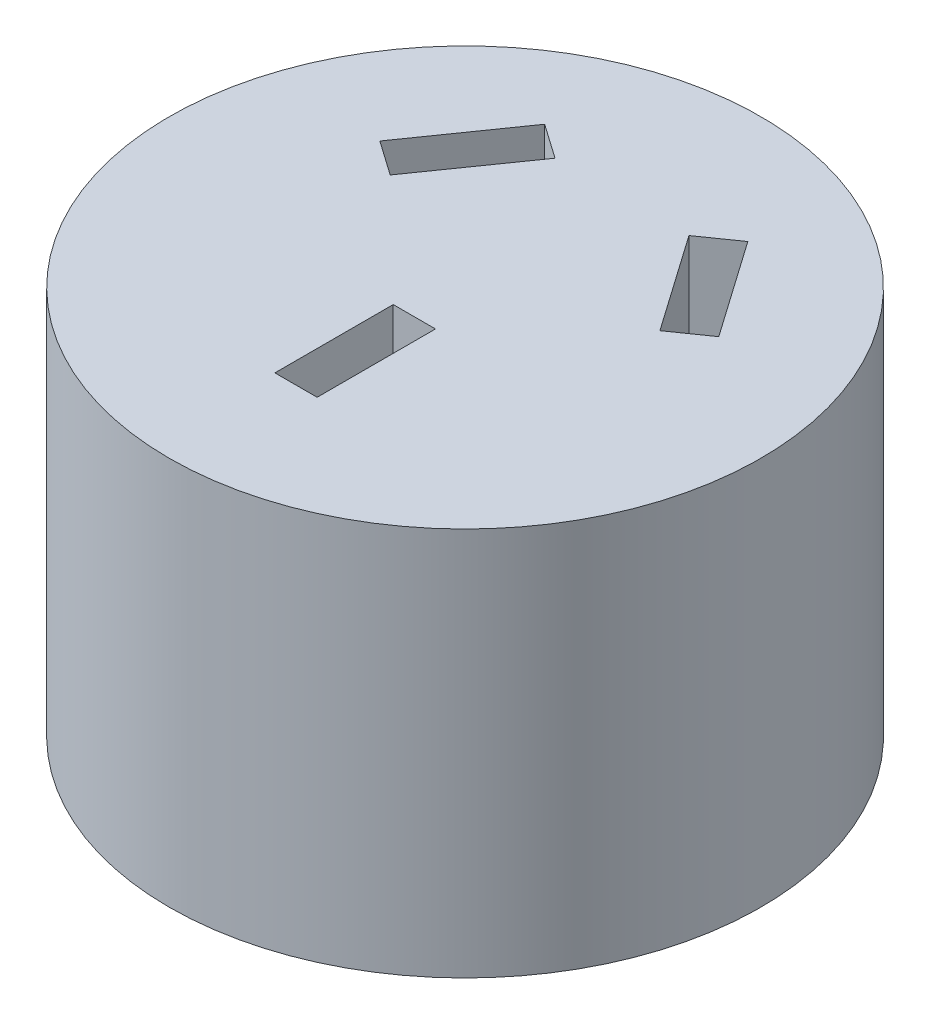
ISO-10303-21;
HEADER;
FILE_DESCRIPTION(('STEP AP214'),'2;1');
FILE_NAME('part.step','',(''),(''),'','','');
FILE_SCHEMA(('AUTOMOTIVE_DESIGN { 1 0 10303 214 1 1 1 1 }'));
ENDSEC;
DATA;
#1=APPLICATION_CONTEXT('core data for automotive mechanical design processes');
#2=APPLICATION_PROTOCOL_DEFINITION('international standard','automotive_design',2000,#1);
#3=PRODUCT_CONTEXT('',#1,'mechanical');
#4=PRODUCT('Part','Part','',(#3));
#5=PRODUCT_RELATED_PRODUCT_CATEGORY('part','',(#4));
#6=PRODUCT_DEFINITION_FORMATION('','',#4);
#7=PRODUCT_DEFINITION_CONTEXT('part definition',#1,'design');
#8=PRODUCT_DEFINITION('design','',#6,#7);
#9=PRODUCT_DEFINITION_SHAPE('','',#8);
#10=(LENGTH_UNIT() NAMED_UNIT(*) SI_UNIT(.MILLI.,.METRE.));
#11=(NAMED_UNIT(*) PLANE_ANGLE_UNIT() SI_UNIT($,.RADIAN.));
#12=(NAMED_UNIT(*) SI_UNIT($,.STERADIAN.) SOLID_ANGLE_UNIT());
#13=UNCERTAINTY_MEASURE_WITH_UNIT(LENGTH_MEASURE(1.E-05),#10,'distance_accuracy_value','');
#14=(GEOMETRIC_REPRESENTATION_CONTEXT(3) GLOBAL_UNCERTAINTY_ASSIGNED_CONTEXT((#13)) GLOBAL_UNIT_ASSIGNED_CONTEXT((#10,
#11,#12)) REPRESENTATION_CONTEXT('',''));
#15=CARTESIAN_POINT('',(0.,0.,0.));
#16=DIRECTION('',(0.,0.,1.));
#17=DIRECTION('',(1.,0.,0.));
#18=AXIS2_PLACEMENT_3D('',#15,#16,#17);
#19=CARTESIAN_POINT('',(0.,-11.5,0.));
#20=DIRECTION('',(0.,1.,0.));
#21=DIRECTION('',(0.,0.,1.));
#22=AXIS2_PLACEMENT_3D('',#19,#20,#21);
#23=CYLINDRICAL_SURFACE('',#22,17.5);
#24=CARTESIAN_POINT('',(-13.1596499769309,1.66512361776483,11.5357536591531));
#25=CARTESIAN_POINT('',(-13.1596555340036,1.9397524624613,11.5357507632046));
#26=CARTESIAN_POINT('',(-13.175312887176,2.21443132840201,11.517959771554));
#27=CARTESIAN_POINT('',(-13.2368491284706,2.75580171492137,11.4471811512366));
#28=CARTESIAN_POINT('',(-13.2827403091384,3.02248994051615,11.3941792063387));
#29=CARTESIAN_POINT('',(-13.4015471420366,3.53996661994382,11.2541938799733));
#30=CARTESIAN_POINT('',(-13.4744209409699,3.79077899730775,11.1672631149614));
#31=CARTESIAN_POINT('',(-13.6427187170808,4.27054314665069,10.9610160038921));
#32=CARTESIAN_POINT('',(-13.7381453715128,4.49949231870991,10.8416958126289));
#33=CARTESIAN_POINT('',(-13.9489856580926,4.93560253105194,10.5691143312473));
#34=CARTESIAN_POINT('',(-14.0648540806705,5.14204312308788,10.4150519022994));
#35=CARTESIAN_POINT('',(-14.3086992048061,5.52088057602431,10.0774216904281));
#36=CARTESIAN_POINT('',(-14.4366773215917,5.69327345057194,9.89385045713246));
#37=CARTESIAN_POINT('',(-14.7009857453358,6.00219523864863,9.49678147960872));
#38=CARTESIAN_POINT('',(-14.8374271085469,6.13799766714229,9.28279073388649));
#39=CARTESIAN_POINT('',(-15.1099871860003,6.36512805380476,8.83218586376441));
#40=CARTESIAN_POINT('',(-15.2461059579196,6.4564646708655,8.5955761547329));
#41=CARTESIAN_POINT('',(-15.5085846047979,6.58970977086412,8.1121784031836));
#42=CARTESIAN_POINT('',(-15.6351064652621,6.63284617202653,7.86581722802317));
#43=CARTESIAN_POINT('',(-15.8774937641688,6.67234045247293,7.36428542439035));
#44=CARTESIAN_POINT('',(-15.993361235352,6.66870727360822,7.10911648917274));
#45=CARTESIAN_POINT('',(-16.2078648939097,6.6156076804698,6.60514966089287));
#46=CARTESIAN_POINT('',(-16.3069024529847,6.56746958616994,6.35638089269609));
#47=CARTESIAN_POINT('',(-16.4899416249498,6.42888586160385,5.86519914186244));
#48=CARTESIAN_POINT('',(-16.5739423225383,6.33843765710932,5.62278654689518));
#49=CARTESIAN_POINT('',(-16.7272785339865,6.11685011573552,5.1488752620366));
#50=CARTESIAN_POINT('',(-16.7964436553654,5.98527667324486,4.9175248866455));
#51=CARTESIAN_POINT('',(-16.9196159240415,5.68551215176894,4.47541536025799));
#52=CARTESIAN_POINT('',(-16.9736197437573,5.51731304859548,4.26466073619512));
#53=CARTESIAN_POINT('',(-17.0695749057091,5.14210934122165,3.86312817033936));
#54=CARTESIAN_POINT('',(-17.1110367589145,4.93395003376466,3.67331087277448));
#55=CARTESIAN_POINT('',(-17.1813581012118,4.48833588813751,3.32894981796366));
#56=CARTESIAN_POINT('',(-17.2102165679262,4.25087867534587,3.17440892279879));
#57=CARTESIAN_POINT('',(-17.2576877018223,3.75079640655649,2.9053589842402));
#58=CARTESIAN_POINT('',(-17.2762167311151,3.48798555528976,2.7911793898275));
#59=CARTESIAN_POINT('',(-17.3045820773682,2.94624070916338,2.60959404642087));
#60=CARTESIAN_POINT('',(-17.3144209238164,2.66731143116368,2.54217468795753));
#61=CARTESIAN_POINT('',(-17.3264584703526,2.11142255690001,2.45877282563744));
#62=CARTESIAN_POINT('',(-17.3289058247193,1.83471907542317,2.44111763783853));
#63=CARTESIAN_POINT('',(-17.327187354544,1.28240282797153,2.45328789796236));
#64=CARTESIAN_POINT('',(-17.3230223549337,1.00678993023994,2.48310742312519));
#65=CARTESIAN_POINT('',(-17.3077179171922,0.47102054770508,2.5875762676201));
#66=CARTESIAN_POINT('',(-17.2967403588561,0.210654652726296,2.66118346959825));
#67=CARTESIAN_POINT('',(-17.2667561570037,-0.294381062228878,2.84923472440934));
#68=CARTESIAN_POINT('',(-17.247748354869,-0.539048611349121,2.96368466973801));
#69=CARTESIAN_POINT('',(-17.1994400146767,-1.01243157027722,3.23238029923699));
#70=CARTESIAN_POINT('',(-17.1698964422816,-1.24060249274071,3.38754057417764));
#71=CARTESIAN_POINT('',(-17.0986017471394,-1.66856731584353,3.73074797187346));
#72=CARTESIAN_POINT('',(-17.0568479775332,-1.8683550497655,3.91880222164676));
#73=CARTESIAN_POINT('',(-16.9575620070649,-2.24082492795565,4.32861898888295));
#74=CARTESIAN_POINT('',(-16.8995445643161,-2.41236381078201,4.55130540877333));
#75=CARTESIAN_POINT('',(-16.7668303379077,-2.714990585692,5.01818783615075));
#76=CARTESIAN_POINT('',(-16.6921344263847,-2.84608059204112,5.26238271853106));
#77=CARTESIAN_POINT('',(-16.5261205577387,-3.062837099801,5.76247742000632));
#78=CARTESIAN_POINT('',(-16.434935742535,-3.14884735620058,6.01827200293196));
#79=CARTESIAN_POINT('',(-16.2363909809542,-3.27394338708562,6.53499092710229));
#80=CARTESIAN_POINT('',(-16.1290352035626,-3.31304123268845,6.79591393117305));
#81=CARTESIAN_POINT('',(-15.904602445531,-3.34235496722967,7.3053680837599));
#82=CARTESIAN_POINT('',(-15.7879983109241,-3.3342367549423,7.55401294319619));
#83=CARTESIAN_POINT('',(-15.5455727303956,-3.27328067870938,8.041092885262));
#84=CARTESIAN_POINT('',(-15.4197517261324,-3.2204449562798,8.27952845623859));
#85=CARTESIAN_POINT('',(-15.1646798649361,-3.07254797978833,8.73789051610785));
#86=CARTESIAN_POINT('',(-15.0354697256479,-2.97786843487626,8.95796341629023));
#87=CARTESIAN_POINT('',(-14.7776947373397,-2.74931098652046,9.3771183871229));
#88=CARTESIAN_POINT('',(-14.6491299913583,-2.61542701450074,9.57619720153908));
#89=CARTESIAN_POINT('',(-14.3943860918973,-2.30763303867707,9.95516786172013));
#90=CARTESIAN_POINT('',(-14.2683915695826,-2.13265116527903,10.1343130939723));
#91=CARTESIAN_POINT('',(-14.0289298354482,-1.74960356858545,10.4632984507903));
#92=CARTESIAN_POINT('',(-13.9154660995505,-1.54152870446752,10.6131304529899));
#93=CARTESIAN_POINT('',(-13.7042845643893,-1.09163408979746,10.8845298076286));
#94=CARTESIAN_POINT('',(-13.6070586590022,-0.849071513678956,11.0052513377265));
#95=CARTESIAN_POINT('',(-13.4380907687255,-0.341071719153811,11.2109565362252));
#96=CARTESIAN_POINT('',(-13.3663345236454,-0.0756474045707011,11.2959602075894));
#97=CARTESIAN_POINT('',(-13.2606479078092,0.434257868386897,11.4197600061202));
#98=CARTESIAN_POINT('',(-13.2229636754451,0.676849488032007,11.4631884322895));
#99=CARTESIAN_POINT('',(-13.1724641572955,1.16798891363376,11.5211842921135));
#100=CARTESIAN_POINT('',(-13.1596449467938,1.41653577333953,11.5357562805004));
#101=CARTESIAN_POINT('',(-13.1596499769309,1.66512361776483,11.5357536591531));
#102=B_SPLINE_CURVE_WITH_KNOTS('',3,(#24,#25,#26,#27,#28,#29,#30,#31,#32,#33,#34,#35,#36,#37,
#38,#39,#40,#41,#42,#43,#44,#45,#46,#47,#48,#49,#50,#51,#52,#53,#54,#55,#56,#57,#58,#59,#60,#61,
#62,#63,#64,#65,#66,#67,#68,#69,#70,#71,#72,#73,#74,#75,#76,#77,#78,#79,#80,#81,#82,#83,#84,#85,
#86,#87,#88,#89,#90,#91,#92,#93,#94,#95,#96,#97,#98,#99,#100,#101),.UNSPECIFIED.,.T.,.F.,(4,2,2,
2,2,2,2,2,2,2,2,2,2,2,2,2,2,2,2,2,2,2,2,2,2,2,2,2,2,2,2,2,2,2,2,2,2,2,4),(0.,0.822970855909878,
1.64627652404716,2.4683104593411,3.29044202751837,4.13392918016541,4.97751503096208,
5.83678707534616,6.69589172544265,7.53257252571856,8.36909336381046,9.18142594108555,
9.99380794866306,10.8150725844623,11.6365173296209,12.486790317325,13.337132265744,
14.1942630157851,15.0511441949008,15.8788590834125,16.7064707175367,17.5151322414882,
18.3239104804765,19.152700151135,19.9816696155781,20.8386347094919,21.6955550021917,
22.5458421325277,23.3959104269914,24.216172442177,25.0363951773398,25.8492853098058,
26.6623013386561,27.4994942187098,28.3369187479583,29.1963403106312,30.0552799305204,
30.8003322217915,31.5452669038042),.UNSPECIFIED.);
#103=CARTESIAN_POINT('',(-13.1596499769309,1.66512361776483,11.5357536591531));
#104=VERTEX_POINT('',#103);
#105=EDGE_CURVE('E11',#104,#104,#102,.T.);
#106=ORIENTED_EDGE('',*,*,#105,.F.);
#107=EDGE_LOOP('',(#106));
#108=FACE_BOUND('',#107,.T.);
#109=CARTESIAN_POINT('',(0.,-11.5,0.));
#110=DIRECTION('',(0.,1.,0.));
#111=DIRECTION('',(0.,0.,1.));
#112=AXIS2_PLACEMENT_3D('',#109,#110,#111);
#113=CIRCLE('',#112,17.5);
#114=CARTESIAN_POINT('',(0.,-11.5,17.5));
#115=VERTEX_POINT('',#114);
#116=EDGE_CURVE('E46',#115,#115,#113,.T.);
#117=ORIENTED_EDGE('',*,*,#116,.T.);
#118=EDGE_LOOP('',(#117));
#119=FACE_BOUND('',#118,.T.);
#120=CARTESIAN_POINT('',(0.,11.5,0.));
#121=DIRECTION('',(0.,1.,0.));
#122=DIRECTION('',(0.,0.,1.));
#123=AXIS2_PLACEMENT_3D('',#120,#121,#122);
#124=CIRCLE('',#123,17.5);
#125=CARTESIAN_POINT('',(0.,11.5,17.5));
#126=VERTEX_POINT('',#125);
#127=EDGE_CURVE('E166',#126,#126,#124,.T.);
#128=ORIENTED_EDGE('',*,*,#127,.F.);
#129=EDGE_LOOP('',(#128));
#130=FACE_BOUND('',#129,.T.);
#131=ADVANCED_FACE('F34',(#108,#119,#130),#23,.T.);
#132=CARTESIAN_POINT('',(0.,-11.5,0.));
#133=DIRECTION('',(0.,1.,0.));
#134=DIRECTION('',(0.,0.,1.));
#135=AXIS2_PLACEMENT_3D('',#132,#133,#134);
#136=PLANE('',#135);
#137=CARTESIAN_POINT('',(10.,-11.5,3.));
#138=DIRECTION('',(0.,-1.,0.));
#139=DIRECTION('',(0.,0.,-1.));
#140=AXIS2_PLACEMENT_3D('',#137,#138,#139);
#141=CIRCLE('',#140,2.80000000000001);
#142=CARTESIAN_POINT('',(10.,-11.5,0.199999999999986));
#143=VERTEX_POINT('',#142);
#144=EDGE_CURVE('E336',#143,#143,#141,.T.);
#145=ORIENTED_EDGE('',*,*,#144,.F.);
#146=EDGE_LOOP('',(#145));
#147=FACE_BOUND('',#146,.T.);
#148=CARTESIAN_POINT('',(-10.,-11.5,3.));
#149=DIRECTION('',(0.,-1.,0.));
#150=DIRECTION('',(0.,0.,-1.));
#151=AXIS2_PLACEMENT_3D('',#148,#149,#150);
#152=CIRCLE('',#151,2.80000000000001);
#153=CARTESIAN_POINT('',(-10.,-11.5,0.199999999999986));
#154=VERTEX_POINT('',#153);
#155=EDGE_CURVE('E341',#154,#154,#152,.T.);
#156=ORIENTED_EDGE('',*,*,#155,.F.);
#157=EDGE_LOOP('',(#156));
#158=FACE_BOUND('',#157,.T.);
#159=DIRECTION('',(-1.,0.,0.));
#160=VECTOR('',#159,1.);
#161=CARTESIAN_POINT('',(1.25,-11.5,10.));
#162=LINE('',#161,#160);
#163=CARTESIAN_POINT('',(1.25,-11.5,10.));
#164=VERTEX_POINT('',#163);
#165=CARTESIAN_POINT('',(-1.25,-11.5,10.));
#166=VERTEX_POINT('',#165);
#167=EDGE_CURVE('E143',#164,#166,#162,.T.);
#168=ORIENTED_EDGE('',*,*,#167,.F.);
#169=DIRECTION('',(0.,0.,-1.));
#170=VECTOR('',#169,1.);
#171=CARTESIAN_POINT('',(1.25,-11.5,10.));
#172=LINE('',#171,#170);
#173=CARTESIAN_POINT('',(1.25,-11.5,3.));
#174=VERTEX_POINT('',#173);
#175=EDGE_CURVE('E135',#164,#174,#172,.T.);
#176=ORIENTED_EDGE('',*,*,#175,.T.);
#177=DIRECTION('',(1.,0.,0.));
#178=VECTOR('',#177,1.);
#179=CARTESIAN_POINT('',(-1.25,-11.5,3.));
#180=LINE('',#179,#178);
#181=CARTESIAN_POINT('',(-1.25,-11.5,3.));
#182=VERTEX_POINT('',#181);
#183=EDGE_CURVE('E126',#182,#174,#180,.T.);
#184=ORIENTED_EDGE('',*,*,#183,.F.);
#185=DIRECTION('',(0.,0.,-1.));
#186=VECTOR('',#185,1.);
#187=CARTESIAN_POINT('',(-1.25,-11.5,10.));
#188=LINE('',#187,#186);
#189=EDGE_CURVE('E134',#166,#182,#188,.T.);
#190=ORIENTED_EDGE('',*,*,#189,.F.);
#191=EDGE_LOOP('',(#168,#176,#184,#190));
#192=FACE_BOUND('',#191,.T.);
#193=DIRECTION('',(-0.819152044288993,0.,-0.573576436351044));
#194=VECTOR('',#193,1.);
#195=CARTESIAN_POINT('',(-7.97605994463876,-11.5,-3.54896514453825));
#196=LINE('',#195,#194);
#197=CARTESIAN_POINT('',(-7.97605994463876,-11.5,-3.54896514453825));
#198=VERTEX_POINT('',#197);
#199=CARTESIAN_POINT('',(-10.0239400553612,-11.5,-4.98290623541586));
#200=VERTEX_POINT('',#199);
#201=EDGE_CURVE('E178',#198,#200,#196,.T.);
#202=ORIENTED_EDGE('',*,*,#201,.F.);
#203=DIRECTION('',(0.573576436351044,0.,-0.819152044288993));
#204=VECTOR('',#203,1.);
#205=CARTESIAN_POINT('',(-7.97605994463876,-11.5,-3.54896514453825));
#206=LINE('',#205,#204);
#207=CARTESIAN_POINT('',(-3.96102489018145,-11.5,-9.2830294545612));
#208=VERTEX_POINT('',#207);
#209=EDGE_CURVE('E170',#198,#208,#206,.T.);
#210=ORIENTED_EDGE('',*,*,#209,.T.);
#211=DIRECTION('',(0.819152044288993,0.,0.573576436351045));
#212=VECTOR('',#211,1.);
#213=CARTESIAN_POINT('',(-6.00890500090393,-11.5,-10.7169705454388));
#214=LINE('',#213,#212);
#215=CARTESIAN_POINT('',(-6.00890500090393,-11.5,-10.7169705454388));
#216=VERTEX_POINT('',#215);
#217=EDGE_CURVE('E173',#216,#208,#214,.T.);
#218=ORIENTED_EDGE('',*,*,#217,.F.);
#219=DIRECTION('',(0.573576436351044,0.,-0.819152044288993));
#220=VECTOR('',#219,1.);
#221=CARTESIAN_POINT('',(-10.0239400553612,-11.5,-4.98290623541586));
#222=LINE('',#221,#220);
#223=EDGE_CURVE('E176',#200,#216,#222,.T.);
#224=ORIENTED_EDGE('',*,*,#223,.F.);
#225=EDGE_LOOP('',(#202,#210,#218,#224));
#226=FACE_BOUND('',#225,.T.);
#227=DIRECTION('',(0.819152044288993,0.,-0.573576436351043));
#228=VECTOR('',#227,1.);
#229=CARTESIAN_POINT('',(3.96102489018145,-11.5,-9.2830294545612));
#230=LINE('',#229,#228);
#231=CARTESIAN_POINT('',(3.96102489018145,-11.5,-9.2830294545612));
#232=VERTEX_POINT('',#231);
#233=CARTESIAN_POINT('',(6.00890500090394,-11.5,-10.7169705454388));
#234=VERTEX_POINT('',#233);
#235=EDGE_CURVE('E207',#232,#234,#230,.T.);
#236=ORIENTED_EDGE('',*,*,#235,.F.);
#237=DIRECTION('',(0.573576436351044,0.,0.819152044288993));
#238=VECTOR('',#237,1.);
#239=CARTESIAN_POINT('',(3.96102489018145,-11.5,-9.2830294545612));
#240=LINE('',#239,#238);
#241=CARTESIAN_POINT('',(7.97605994463876,-11.5,-3.54896514453825));
#242=VERTEX_POINT('',#241);
#243=EDGE_CURVE('E198',#232,#242,#240,.T.);
#244=ORIENTED_EDGE('',*,*,#243,.T.);
#245=DIRECTION('',(-0.819152044288993,0.,0.573576436351044));
#246=VECTOR('',#245,1.);
#247=CARTESIAN_POINT('',(10.0239400553612,-11.5,-4.98290623541586));
#248=LINE('',#247,#246);
#249=CARTESIAN_POINT('',(10.0239400553612,-11.5,-4.98290623541586));
#250=VERTEX_POINT('',#249);
#251=EDGE_CURVE('E201',#250,#242,#248,.T.);
#252=ORIENTED_EDGE('',*,*,#251,.F.);
#253=DIRECTION('',(0.573576436351044,0.,0.819152044288993));
#254=VECTOR('',#253,1.);
#255=CARTESIAN_POINT('',(6.00890500090394,-11.5,-10.7169705454388));
#256=LINE('',#255,#254);
#257=EDGE_CURVE('E204',#234,#250,#256,.T.);
#258=ORIENTED_EDGE('',*,*,#257,.F.);
#259=EDGE_LOOP('',(#236,#244,#252,#258));
#260=FACE_BOUND('',#259,.T.);
#261=ORIENTED_EDGE('',*,*,#116,.F.);
#262=EDGE_LOOP('',(#261));
#263=FACE_BOUND('',#262,.T.);
#264=ADVANCED_FACE('F145',(#147,#158,#192,#226,#260,#263),#136,.F.);
#265=CARTESIAN_POINT('',(0.,11.5,0.));
#266=DIRECTION('',(0.,1.,0.));
#267=DIRECTION('',(0.,0.,1.));
#268=AXIS2_PLACEMENT_3D('',#265,#266,#267);
#269=PLANE('',#268);
#270=DIRECTION('',(0.,0.,-1.));
#271=VECTOR('',#270,1.);
#272=CARTESIAN_POINT('',(1.25,11.5,10.));
#273=LINE('',#272,#271);
#274=CARTESIAN_POINT('',(1.25,11.5,10.));
#275=VERTEX_POINT('',#274);
#276=CARTESIAN_POINT('',(1.25,11.5,3.));
#277=VERTEX_POINT('',#276);
#278=EDGE_CURVE('E142',#275,#277,#273,.T.);
#279=ORIENTED_EDGE('',*,*,#278,.F.);
#280=DIRECTION('',(-1.,0.,0.));
#281=VECTOR('',#280,1.);
#282=CARTESIAN_POINT('',(1.25,11.5,10.));
#283=LINE('',#282,#281);
#284=CARTESIAN_POINT('',(-1.25,11.5,10.));
#285=VERTEX_POINT('',#284);
#286=EDGE_CURVE('E147',#275,#285,#283,.T.);
#287=ORIENTED_EDGE('',*,*,#286,.T.);
#288=DIRECTION('',(0.,0.,-1.));
#289=VECTOR('',#288,1.);
#290=CARTESIAN_POINT('',(-1.25,11.5,10.));
#291=LINE('',#290,#289);
#292=CARTESIAN_POINT('',(-1.25,11.5,3.));
#293=VERTEX_POINT('',#292);
#294=EDGE_CURVE('E150',#285,#293,#291,.T.);
#295=ORIENTED_EDGE('',*,*,#294,.T.);
#296=DIRECTION('',(1.,0.,0.));
#297=VECTOR('',#296,1.);
#298=CARTESIAN_POINT('',(-1.25,11.5,3.));
#299=LINE('',#298,#297);
#300=EDGE_CURVE('E159',#293,#277,#299,.T.);
#301=ORIENTED_EDGE('',*,*,#300,.T.);
#302=EDGE_LOOP('',(#279,#287,#295,#301));
#303=FACE_BOUND('',#302,.T.);
#304=DIRECTION('',(0.573576436351044,0.,-0.819152044288993));
#305=VECTOR('',#304,1.);
#306=CARTESIAN_POINT('',(-7.97605994463876,11.5,-3.54896514453825));
#307=LINE('',#306,#305);
#308=CARTESIAN_POINT('',(-7.97605994463876,11.5,-3.54896514453825));
#309=VERTEX_POINT('',#308);
#310=CARTESIAN_POINT('',(-3.96102489018145,11.5,-9.2830294545612));
#311=VERTEX_POINT('',#310);
#312=EDGE_CURVE('E181',#309,#311,#307,.T.);
#313=ORIENTED_EDGE('',*,*,#312,.F.);
#314=DIRECTION('',(-0.819152044288993,0.,-0.573576436351044));
#315=VECTOR('',#314,1.);
#316=CARTESIAN_POINT('',(-7.97605994463876,11.5,-3.54896514453825));
#317=LINE('',#316,#315);
#318=CARTESIAN_POINT('',(-10.0239400553612,11.5,-4.98290623541586));
#319=VERTEX_POINT('',#318);
#320=EDGE_CURVE('E174',#309,#319,#317,.T.);
#321=ORIENTED_EDGE('',*,*,#320,.T.);
#322=DIRECTION('',(0.573576436351044,0.,-0.819152044288993));
#323=VECTOR('',#322,1.);
#324=CARTESIAN_POINT('',(-10.0239400553612,11.5,-4.98290623541586));
#325=LINE('',#324,#323);
#326=CARTESIAN_POINT('',(-6.00890500090393,11.5,-10.7169705454388));
#327=VERTEX_POINT('',#326);
#328=EDGE_CURVE('E187',#319,#327,#325,.T.);
#329=ORIENTED_EDGE('',*,*,#328,.T.);
#330=DIRECTION('',(0.819152044288993,0.,0.573576436351045));
#331=VECTOR('',#330,1.);
#332=CARTESIAN_POINT('',(-6.00890500090393,11.5,-10.7169705454388));
#333=LINE('',#332,#331);
#334=EDGE_CURVE('E183',#327,#311,#333,.T.);
#335=ORIENTED_EDGE('',*,*,#334,.T.);
#336=EDGE_LOOP('',(#313,#321,#329,#335));
#337=FACE_BOUND('',#336,.T.);
#338=DIRECTION('',(0.573576436351044,0.,0.819152044288993));
#339=VECTOR('',#338,1.);
#340=CARTESIAN_POINT('',(3.96102489018145,11.5,-9.2830294545612));
#341=LINE('',#340,#339);
#342=CARTESIAN_POINT('',(3.96102489018145,11.5,-9.2830294545612));
#343=VERTEX_POINT('',#342);
#344=CARTESIAN_POINT('',(7.97605994463876,11.5,-3.54896514453825));
#345=VERTEX_POINT('',#344);
#346=EDGE_CURVE('E210',#343,#345,#341,.T.);
#347=ORIENTED_EDGE('',*,*,#346,.F.);
#348=DIRECTION('',(0.819152044288993,0.,-0.573576436351043));
#349=VECTOR('',#348,1.);
#350=CARTESIAN_POINT('',(3.96102489018145,11.5,-9.2830294545612));
#351=LINE('',#350,#349);
#352=CARTESIAN_POINT('',(6.00890500090394,11.5,-10.7169705454388));
#353=VERTEX_POINT('',#352);
#354=EDGE_CURVE('E202',#343,#353,#351,.T.);
#355=ORIENTED_EDGE('',*,*,#354,.T.);
#356=DIRECTION('',(0.573576436351044,0.,0.819152044288993));
#357=VECTOR('',#356,1.);
#358=CARTESIAN_POINT('',(6.00890500090394,11.5,-10.7169705454388));
#359=LINE('',#358,#357);
#360=CARTESIAN_POINT('',(10.0239400553612,11.5,-4.98290623541586));
#361=VERTEX_POINT('',#360);
#362=EDGE_CURVE('E215',#353,#361,#359,.T.);
#363=ORIENTED_EDGE('',*,*,#362,.T.);
#364=DIRECTION('',(-0.819152044288993,0.,0.573576436351044));
#365=VECTOR('',#364,1.);
#366=CARTESIAN_POINT('',(10.0239400553612,11.5,-4.98290623541586));
#367=LINE('',#366,#365);
#368=EDGE_CURVE('E212',#361,#345,#367,.T.);
#369=ORIENTED_EDGE('',*,*,#368,.T.);
#370=EDGE_LOOP('',(#347,#355,#363,#369));
#371=FACE_BOUND('',#370,.T.);
#372=ORIENTED_EDGE('',*,*,#127,.T.);
#373=EDGE_LOOP('',(#372));
#374=FACE_BOUND('',#373,.T.);
#375=ADVANCED_FACE('F234',(#303,#337,#371,#374),#269,.T.);
#376=CARTESIAN_POINT('',(3.96102489018145,-11.5,-9.2830294545612));
#377=DIRECTION('',(-0.819152044288993,0.,0.573576436351044));
#378=DIRECTION('',(0.573576436351044,0.,0.819152044288993));
#379=AXIS2_PLACEMENT_3D('',#376,#377,#378);
#380=PLANE('',#379);
#381=ORIENTED_EDGE('',*,*,#346,.T.);
#382=DIRECTION('',(0.,1.,0.));
#383=VECTOR('',#382,1.);
#384=CARTESIAN_POINT('',(7.97605994463876,-11.5,-3.54896514453825));
#385=LINE('',#384,#383);
#386=EDGE_CURVE('E209',#242,#345,#385,.T.);
#387=ORIENTED_EDGE('',*,*,#386,.F.);
#388=ORIENTED_EDGE('',*,*,#243,.F.);
#389=DIRECTION('',(0.,1.,0.));
#390=VECTOR('',#389,1.);
#391=CARTESIAN_POINT('',(3.96102489018145,-11.5,-9.2830294545612));
#392=LINE('',#391,#390);
#393=EDGE_CURVE('E184',#232,#343,#392,.T.);
#394=ORIENTED_EDGE('',*,*,#393,.T.);
#395=EDGE_LOOP('',(#381,#387,#388,#394));
#396=FACE_BOUND('',#395,.T.);
#397=ADVANCED_FACE('F240',(#396),#380,.F.);
#398=CARTESIAN_POINT('',(3.96102489018145,-11.5,-9.2830294545612));
#399=DIRECTION('',(0.573576436351044,0.,0.819152044288994));
#400=DIRECTION('',(0.819152044288994,0.,-0.573576436351044));
#401=AXIS2_PLACEMENT_3D('',#398,#399,#400);
#402=PLANE('',#401);
#403=ORIENTED_EDGE('',*,*,#354,.F.);
#404=ORIENTED_EDGE('',*,*,#393,.F.);
#405=ORIENTED_EDGE('',*,*,#235,.T.);
#406=DIRECTION('',(0.,1.,0.));
#407=VECTOR('',#406,1.);
#408=CARTESIAN_POINT('',(6.00890500090394,-11.5,-10.7169705454388));
#409=LINE('',#408,#407);
#410=EDGE_CURVE('E221',#234,#353,#409,.T.);
#411=ORIENTED_EDGE('',*,*,#410,.T.);
#412=EDGE_LOOP('',(#403,#404,#405,#411));
#413=FACE_BOUND('',#412,.T.);
#414=ADVANCED_FACE('F249',(#413),#402,.T.);
#415=CARTESIAN_POINT('',(6.00890500090394,-11.5,-10.7169705454388));
#416=DIRECTION('',(-0.819152044288993,0.,0.573576436351044));
#417=DIRECTION('',(0.573576436351044,0.,0.819152044288993));
#418=AXIS2_PLACEMENT_3D('',#415,#416,#417);
#419=PLANE('',#418);
#420=ORIENTED_EDGE('',*,*,#362,.F.);
#421=ORIENTED_EDGE('',*,*,#410,.F.);
#422=ORIENTED_EDGE('',*,*,#257,.T.);
#423=DIRECTION('',(0.,1.,0.));
#424=VECTOR('',#423,1.);
#425=CARTESIAN_POINT('',(10.0239400553612,-11.5,-4.98290623541586));
#426=LINE('',#425,#424);
#427=EDGE_CURVE('E223',#250,#361,#426,.T.);
#428=ORIENTED_EDGE('',*,*,#427,.T.);
#429=EDGE_LOOP('',(#420,#421,#422,#428));
#430=FACE_BOUND('',#429,.T.);
#431=ADVANCED_FACE('F255',(#430),#419,.T.);
#432=CARTESIAN_POINT('',(10.0239400553612,-11.5,-4.98290623541586));
#433=DIRECTION('',(-0.573576436351044,0.,-0.819152044288993));
#434=DIRECTION('',(-0.819152044288993,0.,0.573576436351044));
#435=AXIS2_PLACEMENT_3D('',#432,#433,#434);
#436=PLANE('',#435);
#437=ORIENTED_EDGE('',*,*,#368,.F.);
#438=ORIENTED_EDGE('',*,*,#427,.F.);
#439=ORIENTED_EDGE('',*,*,#251,.T.);
#440=ORIENTED_EDGE('',*,*,#386,.T.);
#441=EDGE_LOOP('',(#437,#438,#439,#440));
#442=FACE_BOUND('',#441,.T.);
#443=ADVANCED_FACE('F251',(#442),#436,.T.);
#444=CARTESIAN_POINT('',(-7.97605994463876,-11.5,-3.54896514453825));
#445=DIRECTION('',(0.819152044288993,0.,0.573576436351044));
#446=DIRECTION('',(0.573576436351044,0.,-0.819152044288993));
#447=AXIS2_PLACEMENT_3D('',#444,#445,#446);
#448=PLANE('',#447);
#449=ORIENTED_EDGE('',*,*,#312,.T.);
#450=DIRECTION('',(0.,1.,0.));
#451=VECTOR('',#450,1.);
#452=CARTESIAN_POINT('',(-3.96102489018145,-11.5,-9.2830294545612));
#453=LINE('',#452,#451);
#454=EDGE_CURVE('E180',#208,#311,#453,.T.);
#455=ORIENTED_EDGE('',*,*,#454,.F.);
#456=ORIENTED_EDGE('',*,*,#209,.F.);
#457=DIRECTION('',(0.,1.,0.));
#458=VECTOR('',#457,1.);
#459=CARTESIAN_POINT('',(-7.97605994463876,-11.5,-3.54896514453825));
#460=LINE('',#459,#458);
#461=EDGE_CURVE('E160',#198,#309,#460,.T.);
#462=ORIENTED_EDGE('',*,*,#461,.T.);
#463=EDGE_LOOP('',(#449,#455,#456,#462));
#464=FACE_BOUND('',#463,.T.);
#465=ADVANCED_FACE('F254',(#464),#448,.F.);
#466=CARTESIAN_POINT('',(-7.97605994463876,-11.5,-3.54896514453825));
#467=DIRECTION('',(0.573576436351044,0.,-0.819152044288993));
#468=DIRECTION('',(-0.819152044288993,0.,-0.573576436351044));
#469=AXIS2_PLACEMENT_3D('',#466,#467,#468);
#470=PLANE('',#469);
#471=ORIENTED_EDGE('',*,*,#320,.F.);
#472=ORIENTED_EDGE('',*,*,#461,.F.);
#473=ORIENTED_EDGE('',*,*,#201,.T.);
#474=DIRECTION('',(0.,1.,0.));
#475=VECTOR('',#474,1.);
#476=CARTESIAN_POINT('',(-10.0239400553612,-11.5,-4.98290623541586));
#477=LINE('',#476,#475);
#478=EDGE_CURVE('E193',#200,#319,#477,.T.);
#479=ORIENTED_EDGE('',*,*,#478,.T.);
#480=EDGE_LOOP('',(#471,#472,#473,#479));
#481=FACE_BOUND('',#480,.T.);
#482=ADVANCED_FACE('F265',(#481),#470,.T.);
#483=CARTESIAN_POINT('',(-10.0239400553612,-11.5,-4.98290623541586));
#484=DIRECTION('',(0.819152044288993,0.,0.573576436351044));
#485=DIRECTION('',(0.573576436351044,0.,-0.819152044288993));
#486=AXIS2_PLACEMENT_3D('',#483,#484,#485);
#487=PLANE('',#486);
#488=ORIENTED_EDGE('',*,*,#328,.F.);
#489=ORIENTED_EDGE('',*,*,#478,.F.);
#490=ORIENTED_EDGE('',*,*,#223,.T.);
#491=DIRECTION('',(0.,1.,0.));
#492=VECTOR('',#491,1.);
#493=CARTESIAN_POINT('',(-6.00890500090393,-11.5,-10.7169705454388));
#494=LINE('',#493,#492);
#495=EDGE_CURVE('E61',#216,#327,#494,.T.);
#496=ORIENTED_EDGE('',*,*,#495,.T.);
#497=EDGE_LOOP('',(#488,#489,#490,#496));
#498=FACE_BOUND('',#497,.T.);
#499=ADVANCED_FACE('F270',(#498),#487,.T.);
#500=CARTESIAN_POINT('',(-6.00890500090393,-11.5,-10.7169705454388));
#501=DIRECTION('',(-0.573576436351045,0.,0.819152044288993));
#502=DIRECTION('',(0.819152044288993,0.,0.573576436351045));
#503=AXIS2_PLACEMENT_3D('',#500,#501,#502);
#504=PLANE('',#503);
#505=ORIENTED_EDGE('',*,*,#334,.F.);
#506=ORIENTED_EDGE('',*,*,#495,.F.);
#507=ORIENTED_EDGE('',*,*,#217,.T.);
#508=ORIENTED_EDGE('',*,*,#454,.T.);
#509=EDGE_LOOP('',(#505,#506,#507,#508));
#510=FACE_BOUND('',#509,.T.);
#511=ADVANCED_FACE('F267',(#510),#504,.T.);
#512=CARTESIAN_POINT('',(1.25,-11.5,10.));
#513=DIRECTION('',(1.,0.,0.));
#514=DIRECTION('',(0.,0.,-1.));
#515=AXIS2_PLACEMENT_3D('',#512,#513,#514);
#516=PLANE('',#515);
#517=ORIENTED_EDGE('',*,*,#278,.T.);
#518=DIRECTION('',(0.,1.,0.));
#519=VECTOR('',#518,1.);
#520=CARTESIAN_POINT('',(1.25,-11.5,3.));
#521=LINE('',#520,#519);
#522=EDGE_CURVE('E129',#174,#277,#521,.T.);
#523=ORIENTED_EDGE('',*,*,#522,.F.);
#524=ORIENTED_EDGE('',*,*,#175,.F.);
#525=DIRECTION('',(0.,1.,0.));
#526=VECTOR('',#525,1.);
#527=CARTESIAN_POINT('',(1.25,-11.5,10.));
#528=LINE('',#527,#526);
#529=EDGE_CURVE('E164',#164,#275,#528,.T.);
#530=ORIENTED_EDGE('',*,*,#529,.T.);
#531=EDGE_LOOP('',(#517,#523,#524,#530));
#532=FACE_BOUND('',#531,.T.);
#533=ADVANCED_FACE('F139',(#532),#516,.F.);
#534=CARTESIAN_POINT('',(1.25,-11.5,10.));
#535=DIRECTION('',(0.,0.,-1.));
#536=DIRECTION('',(-1.,0.,0.));
#537=AXIS2_PLACEMENT_3D('',#534,#535,#536);
#538=PLANE('',#537);
#539=ORIENTED_EDGE('',*,*,#286,.F.);
#540=ORIENTED_EDGE('',*,*,#529,.F.);
#541=ORIENTED_EDGE('',*,*,#167,.T.);
#542=DIRECTION('',(0.,1.,0.));
#543=VECTOR('',#542,1.);
#544=CARTESIAN_POINT('',(-1.25,-11.5,10.));
#545=LINE('',#544,#543);
#546=EDGE_CURVE('E167',#166,#285,#545,.T.);
#547=ORIENTED_EDGE('',*,*,#546,.T.);
#548=EDGE_LOOP('',(#539,#540,#541,#547));
#549=FACE_BOUND('',#548,.T.);
#550=ADVANCED_FACE('F279',(#549),#538,.T.);
#551=CARTESIAN_POINT('',(-1.25,-11.5,10.));
#552=DIRECTION('',(1.,0.,0.));
#553=DIRECTION('',(0.,0.,-1.));
#554=AXIS2_PLACEMENT_3D('',#551,#552,#553);
#555=PLANE('',#554);
#556=ORIENTED_EDGE('',*,*,#294,.F.);
#557=ORIENTED_EDGE('',*,*,#546,.F.);
#558=ORIENTED_EDGE('',*,*,#189,.T.);
#559=DIRECTION('',(0.,1.,0.));
#560=VECTOR('',#559,1.);
#561=CARTESIAN_POINT('',(-1.25,-11.5,3.));
#562=LINE('',#561,#560);
#563=EDGE_CURVE('E53',#182,#293,#562,.T.);
#564=ORIENTED_EDGE('',*,*,#563,.T.);
#565=EDGE_LOOP('',(#556,#557,#558,#564));
#566=FACE_BOUND('',#565,.T.);
#567=ADVANCED_FACE('F283',(#566),#555,.T.);
#568=CARTESIAN_POINT('',(-1.25,-11.5,3.));
#569=DIRECTION('',(0.,0.,1.));
#570=DIRECTION('',(1.,0.,0.));
#571=AXIS2_PLACEMENT_3D('',#568,#569,#570);
#572=PLANE('',#571);
#573=ORIENTED_EDGE('',*,*,#300,.F.);
#574=ORIENTED_EDGE('',*,*,#563,.F.);
#575=ORIENTED_EDGE('',*,*,#183,.T.);
#576=ORIENTED_EDGE('',*,*,#522,.T.);
#577=EDGE_LOOP('',(#573,#574,#575,#576));
#578=FACE_BOUND('',#577,.T.);
#579=ADVANCED_FACE('F128',(#578),#572,.T.);
#580=CARTESIAN_POINT('',(-10.,-4.49999999999999,3.));
#581=DIRECTION('',(0.,1.,0.));
#582=DIRECTION('',(0.,0.,1.));
#583=AXIS2_PLACEMENT_3D('',#580,#581,#582);
#584=PLANE('',#583);
#585=CARTESIAN_POINT('',(-10.,-4.49999999999999,3.));
#586=DIRECTION('',(0.,-1.,0.));
#587=DIRECTION('',(0.,0.,-1.));
#588=AXIS2_PLACEMENT_3D('',#585,#586,#587);
#589=CIRCLE('',#588,2.80000000000001);
#590=CARTESIAN_POINT('',(-10.,-4.49999999999999,0.199999999999988));
#591=VERTEX_POINT('',#590);
#592=EDGE_CURVE('E153',#591,#591,#589,.T.);
#593=ORIENTED_EDGE('',*,*,#592,.T.);
#594=EDGE_LOOP('',(#593));
#595=FACE_BOUND('',#594,.T.);
#596=ADVANCED_FACE('F282',(#595),#584,.F.);
#597=CARTESIAN_POINT('',(-10.,-11.5,3.));
#598=DIRECTION('',(0.,-1.,0.));
#599=DIRECTION('',(0.,0.,-1.));
#600=AXIS2_PLACEMENT_3D('',#597,#598,#599);
#601=CYLINDRICAL_SURFACE('',#600,2.80000000000001);
#602=ORIENTED_EDGE('',*,*,#592,.F.);
#603=EDGE_LOOP('',(#602));
#604=FACE_BOUND('',#603,.T.);
#605=ORIENTED_EDGE('',*,*,#155,.T.);
#606=EDGE_LOOP('',(#605));
#607=FACE_BOUND('',#606,.T.);
#608=ADVANCED_FACE('F292',(#604,#607),#601,.F.);
#609=CARTESIAN_POINT('',(10.,-4.49999999999999,3.));
#610=DIRECTION('',(0.,1.,0.));
#611=DIRECTION('',(0.,0.,1.));
#612=AXIS2_PLACEMENT_3D('',#609,#610,#611);
#613=PLANE('',#612);
#614=CARTESIAN_POINT('',(10.,-4.49999999999999,3.));
#615=DIRECTION('',(0.,-1.,0.));
#616=DIRECTION('',(0.,0.,-1.));
#617=AXIS2_PLACEMENT_3D('',#614,#615,#616);
#618=CIRCLE('',#617,2.80000000000001);
#619=CARTESIAN_POINT('',(10.,-4.49999999999999,0.199999999999988));
#620=VERTEX_POINT('',#619);
#621=EDGE_CURVE('E339',#620,#620,#618,.T.);
#622=ORIENTED_EDGE('',*,*,#621,.T.);
#623=EDGE_LOOP('',(#622));
#624=FACE_BOUND('',#623,.T.);
#625=ADVANCED_FACE('F296',(#624),#613,.F.);
#626=CARTESIAN_POINT('',(10.,-11.5,3.));
#627=DIRECTION('',(0.,-1.,0.));
#628=DIRECTION('',(0.,0.,-1.));
#629=AXIS2_PLACEMENT_3D('',#626,#627,#628);
#630=CYLINDRICAL_SURFACE('',#629,2.80000000000001);
#631=ORIENTED_EDGE('',*,*,#621,.F.);
#632=EDGE_LOOP('',(#631));
#633=FACE_BOUND('',#632,.T.);
#634=ORIENTED_EDGE('',*,*,#144,.T.);
#635=EDGE_LOOP('',(#634));
#636=FACE_BOUND('',#635,.T.);
#637=ADVANCED_FACE('F300',(#633,#636),#630,.F.);
#638=CARTESIAN_POINT('',(-2.27243108252794,1.66512361776483,1.04214057360844));
#639=DIRECTION('',(0.908972433011176,0.,-0.41685622944337));
#640=DIRECTION('',(-0.41685622944337,0.,-0.908972433011176));
#641=AXIS2_PLACEMENT_3D('',#638,#639,#640);
#642=PLANE('',#641);
#643=CARTESIAN_POINT('',(-2.27243108252793,1.66512361776483,1.04214057360843));
#644=DIRECTION('',(-0.908972433011176,0.,0.41685622944337));
#645=DIRECTION('',(0.41685622944337,0.,0.908972433011176));
#646=AXIS2_PLACEMENT_3D('',#643,#644,#645);
#647=CIRCLE('',#646,1.50000000000001);
#648=CARTESIAN_POINT('',(-1.64714673836287,1.66512361776483,2.40559922312521));
#649=VERTEX_POINT('',#648);
#650=EDGE_CURVE('E331',#649,#649,#647,.T.);
#651=ORIENTED_EDGE('',*,*,#650,.T.);
#652=EDGE_LOOP('',(#651));
#653=FACE_BOUND('',#652,.T.);
#654=ADVANCED_FACE('F304',(#653),#642,.F.);
#655=CARTESIAN_POINT('',(-15.9070175776956,1.66512361776483,7.29498401525898));
#656=DIRECTION('',(-0.908972433011176,0.,0.41685622944337));
#657=DIRECTION('',(0.41685622944337,0.,0.908972433011176));
#658=AXIS2_PLACEMENT_3D('',#655,#656,#657);
#659=CYLINDRICAL_SURFACE('',#658,1.50000000000001);
#660=ORIENTED_EDGE('',*,*,#650,.F.);
#661=EDGE_LOOP('',(#660));
#662=FACE_BOUND('',#661,.T.);
#663=CARTESIAN_POINT('',(-11.3621554126397,1.66512361776483,5.21070286804213));
#664=DIRECTION('',(-0.908972433011176,0.,0.41685622944337));
#665=DIRECTION('',(0.41685622944337,0.,0.908972433011176));
#666=AXIS2_PLACEMENT_3D('',#663,#664,#665);
#667=CIRCLE('',#666,1.50000000000001);
#668=CARTESIAN_POINT('',(-10.7368710684746,1.66512361776483,6.57416151755891));
#669=VERTEX_POINT('',#668);
#670=EDGE_CURVE('E328',#669,#669,#667,.T.);
#671=ORIENTED_EDGE('',*,*,#670,.T.);
#672=EDGE_LOOP('',(#671));
#673=FACE_BOUND('',#672,.T.);
#674=ADVANCED_FACE('F308',(#662,#673),#659,.F.);
#675=CARTESIAN_POINT('',(-11.3621554126397,3.16512361776484,5.21070286804213));
#676=DIRECTION('',(0.908972433011176,0.,-0.41685622944337));
#677=DIRECTION('',(-0.41685622944337,0.,-0.908972433011176));
#678=AXIS2_PLACEMENT_3D('',#675,#676,#677);
#679=PLANE('',#678);
#680=ORIENTED_EDGE('',*,*,#670,.F.);
#681=EDGE_LOOP('',(#680));
#682=FACE_BOUND('',#681,.T.);
#683=CARTESIAN_POINT('',(-11.3621554126397,1.66512361776483,5.21070286804213));
#684=DIRECTION('',(-0.908972433011176,0.,0.41685622944337));
#685=DIRECTION('',(0.41685622944337,0.,0.908972433011176));
#686=AXIS2_PLACEMENT_3D('',#683,#684,#685);
#687=CIRCLE('',#686,5.00000000000001);
#688=CARTESIAN_POINT('',(-9.27787426542284,1.66512361776483,9.75556503309802));
#689=VERTEX_POINT('',#688);
#690=EDGE_CURVE('E326',#689,#689,#687,.T.);
#691=ORIENTED_EDGE('',*,*,#690,.T.);
#692=EDGE_LOOP('',(#691));
#693=FACE_BOUND('',#692,.T.);
#694=ADVANCED_FACE('F312',(#682,#693),#679,.F.);
#695=CARTESIAN_POINT('',(-15.9070175776956,1.66512361776483,7.29498401525898));
#696=DIRECTION('',(-0.908972433011176,0.,0.41685622944337));
#697=DIRECTION('',(0.41685622944337,0.,0.908972433011176));
#698=AXIS2_PLACEMENT_3D('',#695,#696,#697);
#699=CYLINDRICAL_SURFACE('',#698,5.00000000000001);
#700=ORIENTED_EDGE('',*,*,#105,.T.);
#701=EDGE_LOOP('',(#700));
#702=FACE_BOUND('',#701,.T.);
#703=ORIENTED_EDGE('',*,*,#690,.F.);
#704=EDGE_LOOP('',(#703));
#705=FACE_BOUND('',#704,.T.);
#706=ADVANCED_FACE('F315',(#702,#705),#699,.F.);
#707=CLOSED_SHELL('',(#131,#264,#375,#397,#414,#431,#443,#465,#482,#499,#511,#533,#550,#567,
#579,#596,#608,#625,#637,#654,#674,#694,#706));
#708=MANIFOLD_SOLID_BREP('B2',#707);
#709=ADVANCED_BREP_SHAPE_REPRESENTATION('',(#18,#708),#14);
#710=SHAPE_DEFINITION_REPRESENTATION(#9,#709);
ENDSEC;
END-ISO-10303-21;
